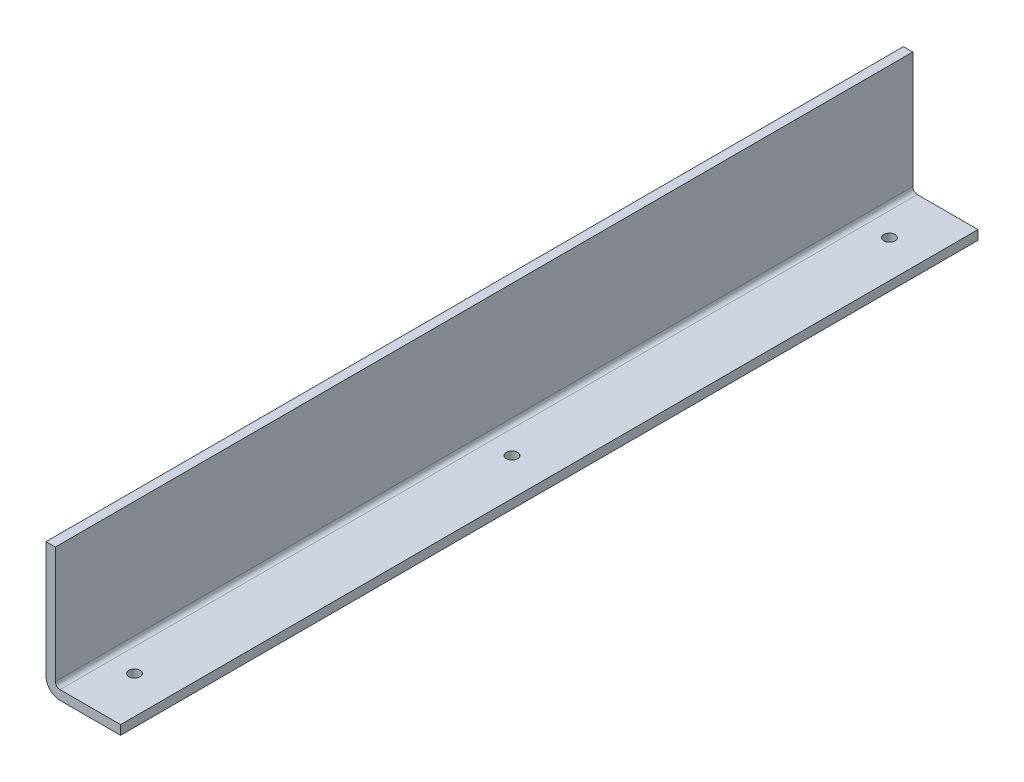
ISO-10303-21;
HEADER;
FILE_DESCRIPTION(('STEP AP214'),'2;1');
FILE_NAME('part.step','',(''),(''),'','','');
FILE_SCHEMA(('AUTOMOTIVE_DESIGN { 1 0 10303 214 1 1 1 1 }'));
ENDSEC;
DATA;
#1=APPLICATION_CONTEXT('core data for automotive mechanical design processes');
#2=APPLICATION_PROTOCOL_DEFINITION('international standard','automotive_design',2000,#1);
#3=PRODUCT_CONTEXT('',#1,'mechanical');
#4=PRODUCT('Part','Part','',(#3));
#5=PRODUCT_RELATED_PRODUCT_CATEGORY('part','',(#4));
#6=PRODUCT_DEFINITION_FORMATION('','',#4);
#7=PRODUCT_DEFINITION_CONTEXT('part definition',#1,'design');
#8=PRODUCT_DEFINITION('design','',#6,#7);
#9=PRODUCT_DEFINITION_SHAPE('','',#8);
#10=(LENGTH_UNIT() NAMED_UNIT(*) SI_UNIT(.MILLI.,.METRE.));
#11=(NAMED_UNIT(*) PLANE_ANGLE_UNIT() SI_UNIT($,.RADIAN.));
#12=(NAMED_UNIT(*) SI_UNIT($,.STERADIAN.) SOLID_ANGLE_UNIT());
#13=UNCERTAINTY_MEASURE_WITH_UNIT(LENGTH_MEASURE(1.E-05),#10,'distance_accuracy_value','');
#14=(GEOMETRIC_REPRESENTATION_CONTEXT(3) GLOBAL_UNCERTAINTY_ASSIGNED_CONTEXT((#13)) GLOBAL_UNIT_ASSIGNED_CONTEXT((#10,
#11,#12)) REPRESENTATION_CONTEXT('',''));
#15=CARTESIAN_POINT('',(0.,0.,0.));
#16=DIRECTION('',(0.,0.,1.));
#17=DIRECTION('',(1.,0.,0.));
#18=AXIS2_PLACEMENT_3D('',#15,#16,#17);
#19=CARTESIAN_POINT('',(15.,0.,460.));
#20=DIRECTION('',(0.,1.,0.));
#21=DIRECTION('',(0.,0.,1.));
#22=AXIS2_PLACEMENT_3D('',#19,#20,#21);
#23=PLANE('',#22);
#24=CARTESIAN_POINT('',(40.,0.,-405.));
#25=DIRECTION('',(0.,1.,0.));
#26=DIRECTION('',(-1.,0.,0.));
#27=AXIS2_PLACEMENT_3D('',#24,#25,#26);
#28=CIRCLE('',#27,6.);
#29=CARTESIAN_POINT('',(34.,0.,-405.));
#30=VERTEX_POINT('',#29);
#31=EDGE_CURVE('E190',#30,#30,#28,.T.);
#32=ORIENTED_EDGE('',*,*,#31,.T.);
#33=EDGE_LOOP('',(#32));
#34=FACE_BOUND('',#33,.T.);
#35=DIRECTION('',(1.,0.,0.));
#36=VECTOR('',#35,1.);
#37=CARTESIAN_POINT('',(15.,0.,-460.));
#38=LINE('',#37,#36);
#39=CARTESIAN_POINT('',(15.,0.,-460.));
#40=VERTEX_POINT('',#39);
#41=CARTESIAN_POINT('',(80.,0.,-460.));
#42=VERTEX_POINT('',#41);
#43=EDGE_CURVE('E142',#40,#42,#38,.T.);
#44=ORIENTED_EDGE('',*,*,#43,.T.);
#45=DIRECTION('',(0.,0.,-1.));
#46=VECTOR('',#45,1.);
#47=CARTESIAN_POINT('',(80.,0.,460.));
#48=LINE('',#47,#46);
#49=CARTESIAN_POINT('',(80.,0.,460.));
#50=VERTEX_POINT('',#49);
#51=EDGE_CURVE('E153',#50,#42,#48,.T.);
#52=ORIENTED_EDGE('',*,*,#51,.F.);
#53=DIRECTION('',(1.,0.,0.));
#54=VECTOR('',#53,1.);
#55=CARTESIAN_POINT('',(15.,0.,460.));
#56=LINE('',#55,#54);
#57=CARTESIAN_POINT('',(15.,0.,460.));
#58=VERTEX_POINT('',#57);
#59=EDGE_CURVE('E176',#58,#50,#56,.T.);
#60=ORIENTED_EDGE('',*,*,#59,.F.);
#61=DIRECTION('',(0.,0.,-1.));
#62=VECTOR('',#61,1.);
#63=CARTESIAN_POINT('',(15.,0.,460.));
#64=LINE('',#63,#62);
#65=EDGE_CURVE('E156',#58,#40,#64,.T.);
#66=ORIENTED_EDGE('',*,*,#65,.T.);
#67=EDGE_LOOP('',(#44,#52,#60,#66));
#68=FACE_BOUND('',#67,.T.);
#69=CARTESIAN_POINT('',(40.,0.,0.));
#70=DIRECTION('',(0.,1.,0.));
#71=DIRECTION('',(-1.,0.,0.));
#72=AXIS2_PLACEMENT_3D('',#69,#70,#71);
#73=CIRCLE('',#72,6.);
#74=CARTESIAN_POINT('',(34.,0.,0.));
#75=VERTEX_POINT('',#74);
#76=EDGE_CURVE('E184',#75,#75,#73,.T.);
#77=ORIENTED_EDGE('',*,*,#76,.T.);
#78=EDGE_LOOP('',(#77));
#79=FACE_BOUND('',#78,.T.);
#80=CARTESIAN_POINT('',(40.,0.,405.));
#81=DIRECTION('',(0.,1.,0.));
#82=DIRECTION('',(-1.,0.,0.));
#83=AXIS2_PLACEMENT_3D('',#80,#81,#82);
#84=CIRCLE('',#83,6.);
#85=CARTESIAN_POINT('',(34.,0.,405.));
#86=VERTEX_POINT('',#85);
#87=EDGE_CURVE('E196',#86,#86,#84,.T.);
#88=ORIENTED_EDGE('',*,*,#87,.T.);
#89=EDGE_LOOP('',(#88));
#90=FACE_BOUND('',#89,.T.);
#91=ADVANCED_FACE('F36',(#34,#68,#79,#90),#23,.F.);
#92=CARTESIAN_POINT('',(15.,10.,460.));
#93=DIRECTION('',(0.,-1.,0.));
#94=DIRECTION('',(1.,0.,0.));
#95=AXIS2_PLACEMENT_3D('',#92,#93,#94);
#96=PLANE('',#95);
#97=CARTESIAN_POINT('',(40.,10.,-405.));
#98=DIRECTION('',(0.,1.,0.));
#99=DIRECTION('',(-1.,0.,0.));
#100=AXIS2_PLACEMENT_3D('',#97,#98,#99);
#101=CIRCLE('',#100,6.);
#102=CARTESIAN_POINT('',(34.,10.,-405.));
#103=VERTEX_POINT('',#102);
#104=EDGE_CURVE('E187',#103,#103,#101,.T.);
#105=ORIENTED_EDGE('',*,*,#104,.F.);
#106=EDGE_LOOP('',(#105));
#107=FACE_BOUND('',#106,.T.);
#108=DIRECTION('',(-1.,0.,0.));
#109=VECTOR('',#108,1.);
#110=CARTESIAN_POINT('',(15.,10.,-460.));
#111=LINE('',#110,#109);
#112=CARTESIAN_POINT('',(80.,10.,-460.));
#113=VERTEX_POINT('',#112);
#114=CARTESIAN_POINT('',(15.,10.,-460.));
#115=VERTEX_POINT('',#114);
#116=EDGE_CURVE('E124',#113,#115,#111,.T.);
#117=ORIENTED_EDGE('',*,*,#116,.T.);
#118=DIRECTION('',(0.,0.,-1.));
#119=VECTOR('',#118,1.);
#120=CARTESIAN_POINT('',(15.,10.,460.));
#121=LINE('',#120,#119);
#122=CARTESIAN_POINT('',(15.,10.,460.));
#123=VERTEX_POINT('',#122);
#124=EDGE_CURVE('E120',#123,#115,#121,.T.);
#125=ORIENTED_EDGE('',*,*,#124,.F.);
#126=DIRECTION('',(-1.,0.,0.));
#127=VECTOR('',#126,1.);
#128=CARTESIAN_POINT('',(15.,10.,460.));
#129=LINE('',#128,#127);
#130=CARTESIAN_POINT('',(80.,10.,460.));
#131=VERTEX_POINT('',#130);
#132=EDGE_CURVE('E109',#131,#123,#129,.T.);
#133=ORIENTED_EDGE('',*,*,#132,.F.);
#134=DIRECTION('',(0.,0.,-1.));
#135=VECTOR('',#134,1.);
#136=CARTESIAN_POINT('',(80.,10.,460.));
#137=LINE('',#136,#135);
#138=EDGE_CURVE('E125',#131,#113,#137,.T.);
#139=ORIENTED_EDGE('',*,*,#138,.T.);
#140=EDGE_LOOP('',(#117,#125,#133,#139));
#141=FACE_BOUND('',#140,.T.);
#142=CARTESIAN_POINT('',(40.,10.,0.));
#143=DIRECTION('',(0.,1.,0.));
#144=DIRECTION('',(-1.,0.,0.));
#145=AXIS2_PLACEMENT_3D('',#142,#143,#144);
#146=CIRCLE('',#145,6.);
#147=CARTESIAN_POINT('',(34.,10.,0.));
#148=VERTEX_POINT('',#147);
#149=EDGE_CURVE('E138',#148,#148,#146,.T.);
#150=ORIENTED_EDGE('',*,*,#149,.F.);
#151=EDGE_LOOP('',(#150));
#152=FACE_BOUND('',#151,.T.);
#153=CARTESIAN_POINT('',(40.,10.,405.));
#154=DIRECTION('',(0.,1.,0.));
#155=DIRECTION('',(-1.,0.,0.));
#156=AXIS2_PLACEMENT_3D('',#153,#154,#155);
#157=CIRCLE('',#156,6.);
#158=CARTESIAN_POINT('',(34.,10.,405.));
#159=VERTEX_POINT('',#158);
#160=EDGE_CURVE('E193',#159,#159,#157,.T.);
#161=ORIENTED_EDGE('',*,*,#160,.F.);
#162=EDGE_LOOP('',(#161));
#163=FACE_BOUND('',#162,.T.);
#164=ADVANCED_FACE('F121',(#107,#141,#152,#163),#96,.F.);
#165=CARTESIAN_POINT('',(0.,140.,460.));
#166=DIRECTION('',(0.,-1.,0.));
#167=DIRECTION('',(0.,0.,-1.));
#168=AXIS2_PLACEMENT_3D('',#165,#166,#167);
#169=PLANE('',#168);
#170=DIRECTION('',(-1.,0.,0.));
#171=VECTOR('',#170,1.);
#172=CARTESIAN_POINT('',(0.,140.,-460.));
#173=LINE('',#172,#171);
#174=CARTESIAN_POINT('',(9.99999999999999,140.,-460.));
#175=VERTEX_POINT('',#174);
#176=CARTESIAN_POINT('',(0.,140.,-460.));
#177=VERTEX_POINT('',#176);
#178=EDGE_CURVE('E134',#175,#177,#173,.T.);
#179=ORIENTED_EDGE('',*,*,#178,.T.);
#180=DIRECTION('',(0.,0.,-1.));
#181=VECTOR('',#180,1.);
#182=CARTESIAN_POINT('',(0.,140.,460.));
#183=LINE('',#182,#181);
#184=CARTESIAN_POINT('',(0.,140.,460.));
#185=VERTEX_POINT('',#184);
#186=EDGE_CURVE('E11',#185,#177,#183,.T.);
#187=ORIENTED_EDGE('',*,*,#186,.F.);
#188=DIRECTION('',(-1.,0.,0.));
#189=VECTOR('',#188,1.);
#190=CARTESIAN_POINT('',(0.,140.,460.));
#191=LINE('',#190,#189);
#192=CARTESIAN_POINT('',(9.99999999999999,140.,460.));
#193=VERTEX_POINT('',#192);
#194=EDGE_CURVE('E149',#193,#185,#191,.T.);
#195=ORIENTED_EDGE('',*,*,#194,.F.);
#196=DIRECTION('',(0.,0.,-1.));
#197=VECTOR('',#196,1.);
#198=CARTESIAN_POINT('',(9.99999999999999,140.,460.));
#199=LINE('',#198,#197);
#200=EDGE_CURVE('E130',#193,#175,#199,.T.);
#201=ORIENTED_EDGE('',*,*,#200,.T.);
#202=EDGE_LOOP('',(#179,#187,#195,#201));
#203=FACE_BOUND('',#202,.T.);
#204=ADVANCED_FACE('F38',(#203),#169,.F.);
#205=CARTESIAN_POINT('',(0.,140.,460.));
#206=DIRECTION('',(1.,0.,0.));
#207=DIRECTION('',(0.,1.,0.));
#208=AXIS2_PLACEMENT_3D('',#205,#206,#207);
#209=PLANE('',#208);
#210=DIRECTION('',(0.,-1.,0.));
#211=VECTOR('',#210,1.);
#212=CARTESIAN_POINT('',(0.,140.,-460.));
#213=LINE('',#212,#211);
#214=CARTESIAN_POINT('',(0.,15.,-460.));
#215=VERTEX_POINT('',#214);
#216=EDGE_CURVE('E137',#177,#215,#213,.T.);
#217=ORIENTED_EDGE('',*,*,#216,.T.);
#218=DIRECTION('',(0.,0.,-1.));
#219=VECTOR('',#218,1.);
#220=CARTESIAN_POINT('',(0.,15.,460.));
#221=LINE('',#220,#219);
#222=CARTESIAN_POINT('',(0.,15.,460.));
#223=VERTEX_POINT('',#222);
#224=EDGE_CURVE('E45',#223,#215,#221,.T.);
#225=ORIENTED_EDGE('',*,*,#224,.F.);
#226=DIRECTION('',(0.,-1.,0.));
#227=VECTOR('',#226,1.);
#228=CARTESIAN_POINT('',(0.,140.,460.));
#229=LINE('',#228,#227);
#230=EDGE_CURVE('E96',#185,#223,#229,.T.);
#231=ORIENTED_EDGE('',*,*,#230,.F.);
#232=ORIENTED_EDGE('',*,*,#186,.T.);
#233=EDGE_LOOP('',(#217,#225,#231,#232));
#234=FACE_BOUND('',#233,.T.);
#235=ADVANCED_FACE('F223',(#234),#209,.F.);
#236=CARTESIAN_POINT('',(15.,15.,460.));
#237=DIRECTION('',(0.,0.,-1.));
#238=DIRECTION('',(-1.,0.,0.));
#239=AXIS2_PLACEMENT_3D('',#236,#237,#238);
#240=CYLINDRICAL_SURFACE('',#239,15.);
#241=CARTESIAN_POINT('',(15.,15.,-460.));
#242=DIRECTION('',(0.,0.,1.));
#243=DIRECTION('',(1.,0.,0.));
#244=AXIS2_PLACEMENT_3D('',#241,#242,#243);
#245=CIRCLE('',#244,15.);
#246=EDGE_CURVE('E140',#215,#40,#245,.T.);
#247=ORIENTED_EDGE('',*,*,#246,.T.);
#248=ORIENTED_EDGE('',*,*,#65,.F.);
#249=CARTESIAN_POINT('',(15.,15.,460.));
#250=DIRECTION('',(0.,0.,1.));
#251=DIRECTION('',(1.,0.,0.));
#252=AXIS2_PLACEMENT_3D('',#249,#250,#251);
#253=CIRCLE('',#252,15.);
#254=EDGE_CURVE('E164',#223,#58,#253,.T.);
#255=ORIENTED_EDGE('',*,*,#254,.F.);
#256=ORIENTED_EDGE('',*,*,#224,.T.);
#257=EDGE_LOOP('',(#247,#248,#255,#256));
#258=FACE_BOUND('',#257,.T.);
#259=ADVANCED_FACE('F162',(#258),#240,.T.);
#260=CARTESIAN_POINT('',(80.,10.,460.));
#261=DIRECTION('',(-1.,0.,0.));
#262=DIRECTION('',(0.,0.,1.));
#263=AXIS2_PLACEMENT_3D('',#260,#261,#262);
#264=PLANE('',#263);
#265=DIRECTION('',(0.,1.,0.));
#266=VECTOR('',#265,1.);
#267=CARTESIAN_POINT('',(80.,10.,-460.));
#268=LINE('',#267,#266);
#269=EDGE_CURVE('E144',#42,#113,#268,.T.);
#270=ORIENTED_EDGE('',*,*,#269,.T.);
#271=ORIENTED_EDGE('',*,*,#138,.F.);
#272=DIRECTION('',(0.,1.,0.));
#273=VECTOR('',#272,1.);
#274=CARTESIAN_POINT('',(80.,10.,460.));
#275=LINE('',#274,#273);
#276=EDGE_CURVE('E115',#50,#131,#275,.T.);
#277=ORIENTED_EDGE('',*,*,#276,.F.);
#278=ORIENTED_EDGE('',*,*,#51,.T.);
#279=EDGE_LOOP('',(#270,#271,#277,#278));
#280=FACE_BOUND('',#279,.T.);
#281=ADVANCED_FACE('F175',(#280),#264,.F.);
#282=CARTESIAN_POINT('',(15.,15.,460.));
#283=DIRECTION('',(0.,0.,-1.));
#284=DIRECTION('',(-1.,0.,0.));
#285=AXIS2_PLACEMENT_3D('',#282,#283,#284);
#286=CYLINDRICAL_SURFACE('',#285,5.);
#287=CARTESIAN_POINT('',(15.,15.,-460.));
#288=DIRECTION('',(0.,0.,-1.));
#289=DIRECTION('',(1.,0.,0.));
#290=AXIS2_PLACEMENT_3D('',#287,#288,#289);
#291=CIRCLE('',#290,5.);
#292=CARTESIAN_POINT('',(10.,15.,-460.));
#293=VERTEX_POINT('',#292);
#294=EDGE_CURVE('E82',#115,#293,#291,.T.);
#295=ORIENTED_EDGE('',*,*,#294,.T.);
#296=DIRECTION('',(0.,0.,-1.));
#297=VECTOR('',#296,1.);
#298=CARTESIAN_POINT('',(10.,15.,460.));
#299=LINE('',#298,#297);
#300=CARTESIAN_POINT('',(10.,15.,460.));
#301=VERTEX_POINT('',#300);
#302=EDGE_CURVE('E126',#301,#293,#299,.T.);
#303=ORIENTED_EDGE('',*,*,#302,.F.);
#304=CARTESIAN_POINT('',(15.,15.,460.));
#305=DIRECTION('',(0.,0.,-1.));
#306=DIRECTION('',(1.,0.,0.));
#307=AXIS2_PLACEMENT_3D('',#304,#305,#306);
#308=CIRCLE('',#307,5.);
#309=EDGE_CURVE('E113',#123,#301,#308,.T.);
#310=ORIENTED_EDGE('',*,*,#309,.F.);
#311=ORIENTED_EDGE('',*,*,#124,.T.);
#312=EDGE_LOOP('',(#295,#303,#310,#311));
#313=FACE_BOUND('',#312,.T.);
#314=ADVANCED_FACE('F128',(#313),#286,.F.);
#315=CARTESIAN_POINT('',(9.99999999999999,140.,460.));
#316=DIRECTION('',(-1.,0.,0.));
#317=DIRECTION('',(0.,-1.,0.));
#318=AXIS2_PLACEMENT_3D('',#315,#316,#317);
#319=PLANE('',#318);
#320=DIRECTION('',(0.,1.,0.));
#321=VECTOR('',#320,1.);
#322=CARTESIAN_POINT('',(9.99999999999999,140.,-460.));
#323=LINE('',#322,#321);
#324=EDGE_CURVE('E88',#293,#175,#323,.T.);
#325=ORIENTED_EDGE('',*,*,#324,.T.);
#326=ORIENTED_EDGE('',*,*,#200,.F.);
#327=DIRECTION('',(0.,1.,0.));
#328=VECTOR('',#327,1.);
#329=CARTESIAN_POINT('',(9.99999999999999,140.,460.));
#330=LINE('',#329,#328);
#331=EDGE_CURVE('E53',#301,#193,#330,.T.);
#332=ORIENTED_EDGE('',*,*,#331,.F.);
#333=ORIENTED_EDGE('',*,*,#302,.T.);
#334=EDGE_LOOP('',(#325,#326,#332,#333));
#335=FACE_BOUND('',#334,.T.);
#336=ADVANCED_FACE('F231',(#335),#319,.F.);
#337=CARTESIAN_POINT('',(15.,15.,460.));
#338=DIRECTION('',(0.,0.,1.));
#339=DIRECTION('',(1.,0.,0.));
#340=AXIS2_PLACEMENT_3D('',#337,#338,#339);
#341=PLANE('',#340);
#342=ORIENTED_EDGE('',*,*,#194,.T.);
#343=ORIENTED_EDGE('',*,*,#230,.T.);
#344=ORIENTED_EDGE('',*,*,#254,.T.);
#345=ORIENTED_EDGE('',*,*,#59,.T.);
#346=ORIENTED_EDGE('',*,*,#276,.T.);
#347=ORIENTED_EDGE('',*,*,#132,.T.);
#348=ORIENTED_EDGE('',*,*,#309,.T.);
#349=ORIENTED_EDGE('',*,*,#331,.T.);
#350=EDGE_LOOP('',(#342,#343,#344,#345,#346,#347,#348,#349));
#351=FACE_BOUND('',#350,.T.);
#352=ADVANCED_FACE('F111',(#351),#341,.T.);
#353=CARTESIAN_POINT('',(15.,15.,-460.));
#354=DIRECTION('',(0.,0.,1.));
#355=DIRECTION('',(1.,0.,0.));
#356=AXIS2_PLACEMENT_3D('',#353,#354,#355);
#357=PLANE('',#356);
#358=ORIENTED_EDGE('',*,*,#178,.F.);
#359=ORIENTED_EDGE('',*,*,#324,.F.);
#360=ORIENTED_EDGE('',*,*,#294,.F.);
#361=ORIENTED_EDGE('',*,*,#116,.F.);
#362=ORIENTED_EDGE('',*,*,#269,.F.);
#363=ORIENTED_EDGE('',*,*,#43,.F.);
#364=ORIENTED_EDGE('',*,*,#246,.F.);
#365=ORIENTED_EDGE('',*,*,#216,.F.);
#366=EDGE_LOOP('',(#358,#359,#360,#361,#362,#363,#364,#365));
#367=FACE_BOUND('',#366,.T.);
#368=ADVANCED_FACE('F168',(#367),#357,.F.);
#369=CARTESIAN_POINT('',(40.,38.7282869805851,0.));
#370=DIRECTION('',(0.,1.,0.));
#371=DIRECTION('',(-1.,0.,0.));
#372=AXIS2_PLACEMENT_3D('',#369,#370,#371);
#373=CYLINDRICAL_SURFACE('',#372,6.);
#374=ORIENTED_EDGE('',*,*,#149,.T.);
#375=EDGE_LOOP('',(#374));
#376=FACE_BOUND('',#375,.T.);
#377=ORIENTED_EDGE('',*,*,#76,.F.);
#378=EDGE_LOOP('',(#377));
#379=FACE_BOUND('',#378,.T.);
#380=ADVANCED_FACE('F209',(#376,#379),#373,.F.);
#381=CARTESIAN_POINT('',(40.,38.7282869805851,-405.));
#382=DIRECTION('',(0.,1.,0.));
#383=DIRECTION('',(-1.,0.,0.));
#384=AXIS2_PLACEMENT_3D('',#381,#382,#383);
#385=CYLINDRICAL_SURFACE('',#384,6.);
#386=ORIENTED_EDGE('',*,*,#104,.T.);
#387=EDGE_LOOP('',(#386));
#388=FACE_BOUND('',#387,.T.);
#389=ORIENTED_EDGE('',*,*,#31,.F.);
#390=EDGE_LOOP('',(#389));
#391=FACE_BOUND('',#390,.T.);
#392=ADVANCED_FACE('F203',(#388,#391),#385,.F.);
#393=CARTESIAN_POINT('',(40.,38.7282869805851,405.));
#394=DIRECTION('',(0.,1.,0.));
#395=DIRECTION('',(-1.,0.,0.));
#396=AXIS2_PLACEMENT_3D('',#393,#394,#395);
#397=CYLINDRICAL_SURFACE('',#396,6.);
#398=ORIENTED_EDGE('',*,*,#160,.T.);
#399=EDGE_LOOP('',(#398));
#400=FACE_BOUND('',#399,.T.);
#401=ORIENTED_EDGE('',*,*,#87,.F.);
#402=EDGE_LOOP('',(#401));
#403=FACE_BOUND('',#402,.T.);
#404=ADVANCED_FACE('F201',(#400,#403),#397,.F.);
#405=CLOSED_SHELL('',(#91,#164,#204,#235,#259,#281,#314,#336,#352,#368,#380,#392,#404));
#406=MANIFOLD_SOLID_BREP('B2',#405);
#407=ADVANCED_BREP_SHAPE_REPRESENTATION('',(#18,#406),#14);
#408=SHAPE_DEFINITION_REPRESENTATION(#9,#407);
ENDSEC;
END-ISO-10303-21;
